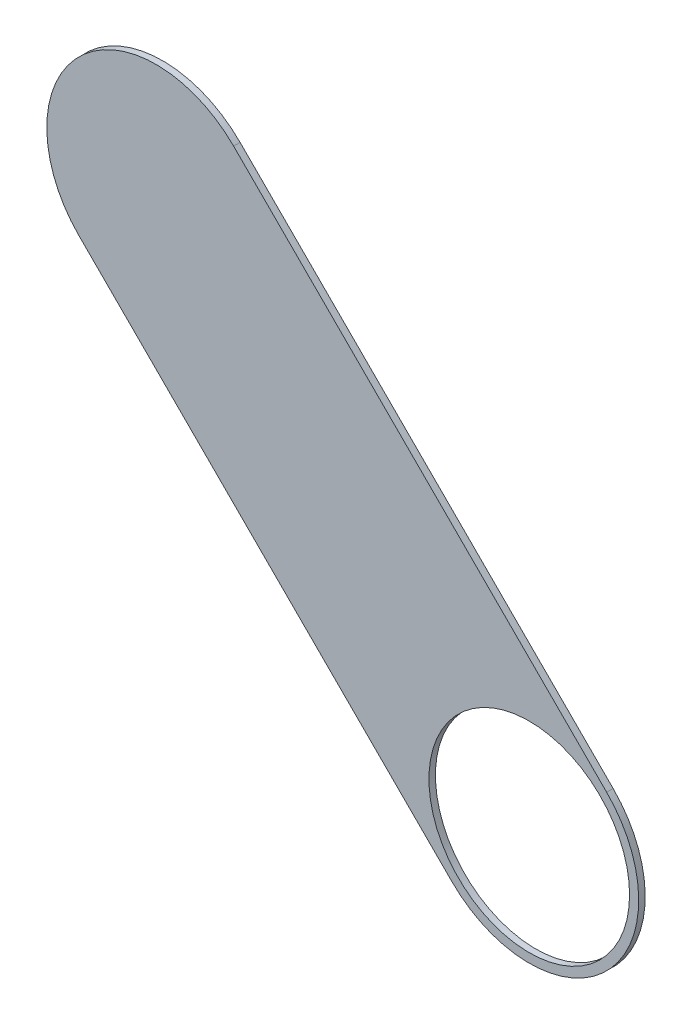
ISO-10303-21;
HEADER;
FILE_DESCRIPTION(('STEP AP214'),'2;1');
FILE_NAME('part.step','',(''),(''),'','','');
FILE_SCHEMA(('AUTOMOTIVE_DESIGN { 1 0 10303 214 1 1 1 1 }'));
ENDSEC;
DATA;
#1=APPLICATION_CONTEXT('core data for automotive mechanical design processes');
#2=APPLICATION_PROTOCOL_DEFINITION('international standard','automotive_design',2000,#1);
#3=PRODUCT_CONTEXT('',#1,'mechanical');
#4=PRODUCT('Part','Part','',(#3));
#5=PRODUCT_RELATED_PRODUCT_CATEGORY('part','',(#4));
#6=PRODUCT_DEFINITION_FORMATION('','',#4);
#7=PRODUCT_DEFINITION_CONTEXT('part definition',#1,'design');
#8=PRODUCT_DEFINITION('design','',#6,#7);
#9=PRODUCT_DEFINITION_SHAPE('','',#8);
#10=(LENGTH_UNIT() NAMED_UNIT(*) SI_UNIT(.MILLI.,.METRE.));
#11=(NAMED_UNIT(*) PLANE_ANGLE_UNIT() SI_UNIT($,.RADIAN.));
#12=(NAMED_UNIT(*) SI_UNIT($,.STERADIAN.) SOLID_ANGLE_UNIT());
#13=UNCERTAINTY_MEASURE_WITH_UNIT(LENGTH_MEASURE(1.E-05),#10,'distance_accuracy_value','');
#14=(GEOMETRIC_REPRESENTATION_CONTEXT(3) GLOBAL_UNCERTAINTY_ASSIGNED_CONTEXT((#13)) GLOBAL_UNIT_ASSIGNED_CONTEXT((#10,
#11,#12)) REPRESENTATION_CONTEXT('',''));
#15=CARTESIAN_POINT('',(0.,0.,0.));
#16=DIRECTION('',(0.,0.,1.));
#17=DIRECTION('',(1.,0.,0.));
#18=AXIS2_PLACEMENT_3D('',#15,#16,#17);
#19=CARTESIAN_POINT('',(83.27276462,72.25157508,0.));
#20=DIRECTION('',(0.707106781186548,0.707106781186548,0.));
#21=DIRECTION('',(0.707106781186548,-0.707106781186548,0.));
#22=AXIS2_PLACEMENT_3D('',#19,#20,#21);
#23=PLANE('',#22);
#24=DIRECTION('',(0.707106781186548,-0.707106781186548,0.));
#25=VECTOR('',#24,1.);
#26=CARTESIAN_POINT('',(83.27276462,72.25157508,0.03556));
#27=LINE('',#26,#25);
#28=CARTESIAN_POINT('',(83.27276462,72.25157508,0.03556));
#29=VERTEX_POINT('',#28);
#30=CARTESIAN_POINT('',(85.31775672,70.20658298,0.03556));
#31=VERTEX_POINT('',#30);
#32=EDGE_CURVE('E11',#29,#31,#27,.T.);
#33=ORIENTED_EDGE('',*,*,#32,.F.);
#34=DIRECTION('',(0.,0.,1.));
#35=VECTOR('',#34,1.);
#36=CARTESIAN_POINT('',(83.27276462,72.25157508,0.));
#37=LINE('',#36,#35);
#38=CARTESIAN_POINT('',(83.27276462,72.25157508,0.));
#39=VERTEX_POINT('',#38);
#40=EDGE_CURVE('E24',#39,#29,#37,.T.);
#41=ORIENTED_EDGE('',*,*,#40,.F.);
#42=DIRECTION('',(0.707106781186548,-0.707106781186548,0.));
#43=VECTOR('',#42,1.);
#44=CARTESIAN_POINT('',(83.27276462,72.25157508,0.));
#45=LINE('',#44,#43);
#46=CARTESIAN_POINT('',(85.31775672,70.20658298,0.));
#47=VERTEX_POINT('',#46);
#48=EDGE_CURVE('E96',#39,#47,#45,.T.);
#49=ORIENTED_EDGE('',*,*,#48,.T.);
#50=DIRECTION('',(0.,0.,1.));
#51=VECTOR('',#50,1.);
#52=CARTESIAN_POINT('',(85.31775672,70.20658298,0.));
#53=LINE('',#52,#51);
#54=EDGE_CURVE('E37',#47,#31,#53,.T.);
#55=ORIENTED_EDGE('',*,*,#54,.T.);
#56=EDGE_LOOP('',(#33,#41,#49,#55));
#57=FACE_BOUND('',#56,.T.);
#58=ADVANCED_FACE('F17',(#57),#23,.F.);
#59=CARTESIAN_POINT('',(83.69702717,72.67583763,0.));
#60=DIRECTION('',(0.,0.,-1.));
#61=DIRECTION('',(0.707106781186548,0.707106781186548,0.));
#62=AXIS2_PLACEMENT_3D('',#59,#60,#61);
#63=CYLINDRICAL_SURFACE('',#62,0.599997852217003);
#64=CARTESIAN_POINT('',(83.69702717,72.67583763,0.03556));
#65=DIRECTION('',(0.,0.,1.));
#66=DIRECTION('',(0.707106781186548,0.707106781186548,0.));
#67=AXIS2_PLACEMENT_3D('',#64,#65,#66);
#68=CIRCLE('',#67,0.599997852217003);
#69=CARTESIAN_POINT('',(84.12128972,73.10010018,0.03556));
#70=VERTEX_POINT('',#69);
#71=EDGE_CURVE('E92',#70,#29,#68,.T.);
#72=ORIENTED_EDGE('',*,*,#71,.F.);
#73=DIRECTION('',(0.,0.,1.));
#74=VECTOR('',#73,1.);
#75=CARTESIAN_POINT('',(84.12128972,73.10010018,0.));
#76=LINE('',#75,#74);
#77=CARTESIAN_POINT('',(84.12128972,73.10010018,0.));
#78=VERTEX_POINT('',#77);
#79=EDGE_CURVE('E90',#78,#70,#76,.T.);
#80=ORIENTED_EDGE('',*,*,#79,.F.);
#81=CARTESIAN_POINT('',(83.69702717,72.67583763,0.));
#82=DIRECTION('',(0.,0.,1.));
#83=DIRECTION('',(0.707106781186548,0.707106781186548,0.));
#84=AXIS2_PLACEMENT_3D('',#81,#82,#83);
#85=CIRCLE('',#84,0.599997852217003);
#86=EDGE_CURVE('E88',#78,#39,#85,.T.);
#87=ORIENTED_EDGE('',*,*,#86,.T.);
#88=ORIENTED_EDGE('',*,*,#40,.T.);
#89=EDGE_LOOP('',(#72,#80,#87,#88));
#90=FACE_BOUND('',#89,.T.);
#91=ADVANCED_FACE('F111',(#90),#63,.T.);
#92=CARTESIAN_POINT('',(85.74201927,70.63084553,0.));
#93=DIRECTION('',(0.,0.,-1.));
#94=DIRECTION('',(-0.707106781186548,-0.707106781186548,0.));
#95=AXIS2_PLACEMENT_3D('',#92,#93,#94);
#96=CYLINDRICAL_SURFACE('',#95,0.599997852216996);
#97=CARTESIAN_POINT('',(85.74201927,70.63084553,0.03556));
#98=DIRECTION('',(0.,0.,1.));
#99=DIRECTION('',(-0.707106781186548,-0.707106781186548,0.));
#100=AXIS2_PLACEMENT_3D('',#97,#98,#99);
#101=CIRCLE('',#100,0.599997852216996);
#102=CARTESIAN_POINT('',(86.16628182,71.05510808,0.03556));
#103=VERTEX_POINT('',#102);
#104=EDGE_CURVE('E85',#31,#103,#101,.T.);
#105=ORIENTED_EDGE('',*,*,#104,.F.);
#106=ORIENTED_EDGE('',*,*,#54,.F.);
#107=CARTESIAN_POINT('',(85.74201927,70.63084553,0.));
#108=DIRECTION('',(0.,0.,1.));
#109=DIRECTION('',(-0.707106781186548,-0.707106781186548,0.));
#110=AXIS2_PLACEMENT_3D('',#107,#108,#109);
#111=CIRCLE('',#110,0.599997852216996);
#112=CARTESIAN_POINT('',(86.16628182,71.05510808,0.));
#113=VERTEX_POINT('',#112);
#114=EDGE_CURVE('E82',#47,#113,#111,.T.);
#115=ORIENTED_EDGE('',*,*,#114,.T.);
#116=DIRECTION('',(0.,0.,1.));
#117=VECTOR('',#116,1.);
#118=CARTESIAN_POINT('',(86.16628182,71.05510808,0.));
#119=LINE('',#118,#117);
#120=EDGE_CURVE('E80',#113,#103,#119,.T.);
#121=ORIENTED_EDGE('',*,*,#120,.T.);
#122=EDGE_LOOP('',(#105,#106,#115,#121));
#123=FACE_BOUND('',#122,.T.);
#124=ADVANCED_FACE('F104',(#123),#96,.T.);
#125=CARTESIAN_POINT('',(86.16628182,71.05510808,0.));
#126=DIRECTION('',(-0.70710678118655,-0.707106781186545,0.));
#127=DIRECTION('',(-0.707106781186545,0.70710678118655,0.));
#128=AXIS2_PLACEMENT_3D('',#125,#126,#127);
#129=PLANE('',#128);
#130=DIRECTION('',(-0.707106781186545,0.70710678118655,0.));
#131=VECTOR('',#130,1.);
#132=CARTESIAN_POINT('',(86.16628182,71.05510808,0.03556));
#133=LINE('',#132,#131);
#134=EDGE_CURVE('E77',#103,#70,#133,.T.);
#135=ORIENTED_EDGE('',*,*,#134,.F.);
#136=ORIENTED_EDGE('',*,*,#120,.F.);
#137=DIRECTION('',(-0.707106781186545,0.70710678118655,0.));
#138=VECTOR('',#137,1.);
#139=CARTESIAN_POINT('',(86.16628182,71.05510808,0.));
#140=LINE('',#139,#138);
#141=EDGE_CURVE('E68',#113,#78,#140,.T.);
#142=ORIENTED_EDGE('',*,*,#141,.T.);
#143=ORIENTED_EDGE('',*,*,#79,.T.);
#144=EDGE_LOOP('',(#135,#136,#142,#143));
#145=FACE_BOUND('',#144,.T.);
#146=ADVANCED_FACE('F110',(#145),#129,.F.);
#147=CARTESIAN_POINT('',(85.742018,70.6308468,0.));
#148=DIRECTION('',(0.,0.,-1.));
#149=DIRECTION('',(1.,0.,0.));
#150=AXIS2_PLACEMENT_3D('',#147,#148,#149);
#151=CYLINDRICAL_SURFACE('',#150,0.5499989);
#152=DIRECTION('',(0.,0.,1.));
#153=VECTOR('',#152,1.);
#154=CARTESIAN_POINT('',(86.2920169,70.6308468,0.));
#155=LINE('',#154,#153);
#156=CARTESIAN_POINT('',(86.2920169,70.6308468,0.));
#157=VERTEX_POINT('',#156);
#158=CARTESIAN_POINT('',(86.2920169,70.6308468,0.03556));
#159=VERTEX_POINT('',#158);
#160=EDGE_CURVE('E62',#157,#159,#155,.T.);
#161=ORIENTED_EDGE('',*,*,#160,.T.);
#162=CARTESIAN_POINT('',(85.742018,70.6308468,0.03556));
#163=DIRECTION('',(0.,0.,1.));
#164=DIRECTION('',(1.,0.,0.));
#165=AXIS2_PLACEMENT_3D('',#162,#163,#164);
#166=CIRCLE('',#165,0.5499989);
#167=EDGE_CURVE('E67',#159,#159,#166,.T.);
#168=ORIENTED_EDGE('',*,*,#167,.T.);
#169=ORIENTED_EDGE('',*,*,#160,.F.);
#170=CARTESIAN_POINT('',(85.742018,70.6308468,0.));
#171=DIRECTION('',(0.,0.,1.));
#172=DIRECTION('',(1.,0.,0.));
#173=AXIS2_PLACEMENT_3D('',#170,#171,#172);
#174=CIRCLE('',#173,0.5499989);
#175=EDGE_CURVE('E65',#157,#157,#174,.T.);
#176=ORIENTED_EDGE('',*,*,#175,.F.);
#177=EDGE_LOOP('',(#161,#168,#169,#176));
#178=FACE_BOUND('',#177,.T.);
#179=ADVANCED_FACE('F64',(#178),#151,.F.);
#180=CARTESIAN_POINT('',(83.27276462,72.25157508,0.));
#181=DIRECTION('',(0.,0.,-1.));
#182=DIRECTION('',(-1.,0.,0.));
#183=AXIS2_PLACEMENT_3D('',#180,#181,#182);
#184=PLANE('',#183);
#185=ORIENTED_EDGE('',*,*,#48,.F.);
#186=ORIENTED_EDGE('',*,*,#86,.F.);
#187=ORIENTED_EDGE('',*,*,#141,.F.);
#188=ORIENTED_EDGE('',*,*,#114,.F.);
#189=EDGE_LOOP('',(#185,#186,#187,#188));
#190=FACE_BOUND('',#189,.T.);
#191=ORIENTED_EDGE('',*,*,#175,.T.);
#192=EDGE_LOOP('',(#191));
#193=FACE_BOUND('',#192,.T.);
#194=ADVANCED_FACE('F71',(#190,#193),#184,.T.);
#195=CARTESIAN_POINT('',(83.27276462,72.25157508,0.03556));
#196=DIRECTION('',(0.,0.,-1.));
#197=DIRECTION('',(-1.,0.,0.));
#198=AXIS2_PLACEMENT_3D('',#195,#196,#197);
#199=PLANE('',#198);
#200=ORIENTED_EDGE('',*,*,#134,.T.);
#201=ORIENTED_EDGE('',*,*,#71,.T.);
#202=ORIENTED_EDGE('',*,*,#32,.T.);
#203=ORIENTED_EDGE('',*,*,#104,.T.);
#204=EDGE_LOOP('',(#200,#201,#202,#203));
#205=FACE_BOUND('',#204,.T.);
#206=ORIENTED_EDGE('',*,*,#167,.F.);
#207=EDGE_LOOP('',(#206));
#208=FACE_BOUND('',#207,.T.);
#209=ADVANCED_FACE('F107',(#205,#208),#199,.F.);
#210=CLOSED_SHELL('',(#58,#91,#124,#146,#179,#194,#209));
#211=MANIFOLD_SOLID_BREP('B1',#210);
#212=ADVANCED_BREP_SHAPE_REPRESENTATION('',(#18,#211),#14);
#213=SHAPE_DEFINITION_REPRESENTATION(#9,#212);
ENDSEC;
END-ISO-10303-21;
